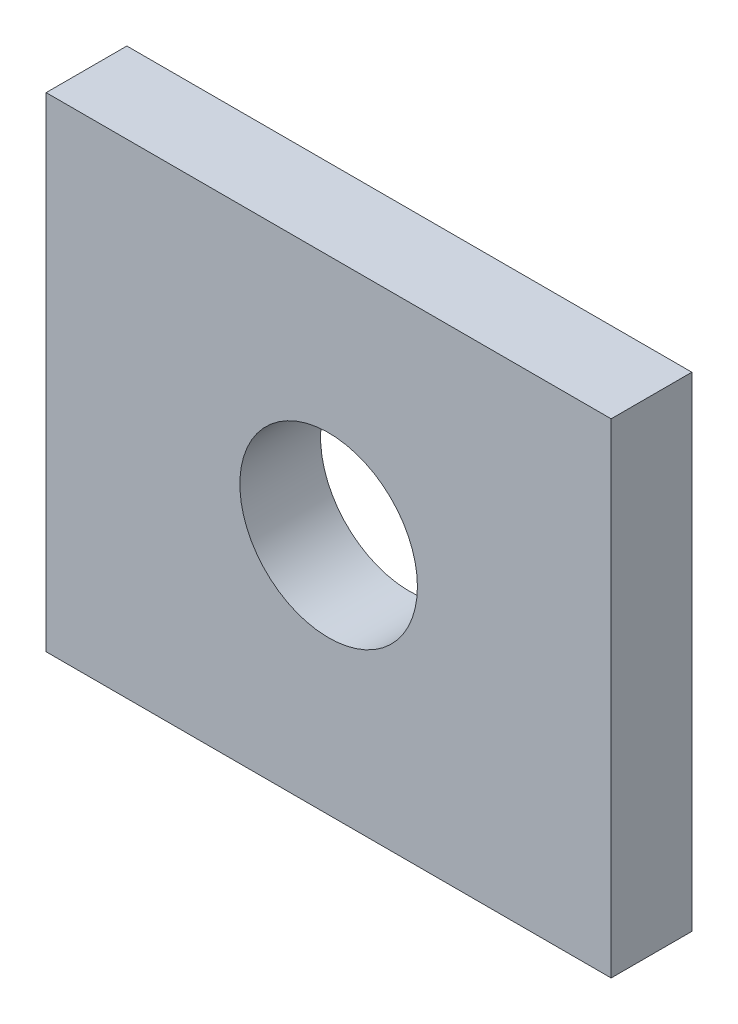
ISO-10303-21;
HEADER;
FILE_DESCRIPTION(('STEP AP214'),'2;1');
FILE_NAME('part.step','',(''),(''),'','','');
FILE_SCHEMA(('AUTOMOTIVE_DESIGN { 1 0 10303 214 1 1 1 1 }'));
ENDSEC;
DATA;
#1=APPLICATION_CONTEXT('core data for automotive mechanical design processes');
#2=APPLICATION_PROTOCOL_DEFINITION('international standard','automotive_design',2000,#1);
#3=PRODUCT_CONTEXT('',#1,'mechanical');
#4=PRODUCT('Part','Part','',(#3));
#5=PRODUCT_RELATED_PRODUCT_CATEGORY('part','',(#4));
#6=PRODUCT_DEFINITION_FORMATION('','',#4);
#7=PRODUCT_DEFINITION_CONTEXT('part definition',#1,'design');
#8=PRODUCT_DEFINITION('design','',#6,#7);
#9=PRODUCT_DEFINITION_SHAPE('','',#8);
#10=(LENGTH_UNIT() NAMED_UNIT(*) SI_UNIT(.MILLI.,.METRE.));
#11=(NAMED_UNIT(*) PLANE_ANGLE_UNIT() SI_UNIT($,.RADIAN.));
#12=(NAMED_UNIT(*) SI_UNIT($,.STERADIAN.) SOLID_ANGLE_UNIT());
#13=UNCERTAINTY_MEASURE_WITH_UNIT(LENGTH_MEASURE(1.E-05),#10,'distance_accuracy_value','');
#14=(GEOMETRIC_REPRESENTATION_CONTEXT(3) GLOBAL_UNCERTAINTY_ASSIGNED_CONTEXT((#13)) GLOBAL_UNIT_ASSIGNED_CONTEXT((#10,
#11,#12)) REPRESENTATION_CONTEXT('',''));
#15=CARTESIAN_POINT('',(0.,0.,0.));
#16=DIRECTION('',(0.,0.,1.));
#17=DIRECTION('',(1.,0.,0.));
#18=AXIS2_PLACEMENT_3D('',#15,#16,#17);
#19=CARTESIAN_POINT('',(-3.5,3.,1.));
#20=DIRECTION('',(1.,0.,0.));
#21=DIRECTION('',(0.,0.,-1.));
#22=AXIS2_PLACEMENT_3D('',#19,#20,#21);
#23=PLANE('',#22);
#24=DIRECTION('',(0.,-1.,0.));
#25=VECTOR('',#24,1.);
#26=CARTESIAN_POINT('',(-3.5,3.,0.));
#27=LINE('',#26,#25);
#28=CARTESIAN_POINT('',(-3.5,3.,0.));
#29=VERTEX_POINT('',#28);
#30=CARTESIAN_POINT('',(-3.5,-3.,0.));
#31=VERTEX_POINT('',#30);
#32=EDGE_CURVE('E106',#29,#31,#27,.T.);
#33=ORIENTED_EDGE('',*,*,#32,.T.);
#34=DIRECTION('',(0.,0.,-1.));
#35=VECTOR('',#34,1.);
#36=CARTESIAN_POINT('',(-3.5,-3.,1.));
#37=LINE('',#36,#35);
#38=CARTESIAN_POINT('',(-3.5,-3.,1.));
#39=VERTEX_POINT('',#38);
#40=EDGE_CURVE('E11',#39,#31,#37,.T.);
#41=ORIENTED_EDGE('',*,*,#40,.F.);
#42=DIRECTION('',(0.,-1.,0.));
#43=VECTOR('',#42,1.);
#44=CARTESIAN_POINT('',(-3.5,3.,1.));
#45=LINE('',#44,#43);
#46=CARTESIAN_POINT('',(-3.5,3.,1.));
#47=VERTEX_POINT('',#46);
#48=EDGE_CURVE('E91',#47,#39,#45,.T.);
#49=ORIENTED_EDGE('',*,*,#48,.F.);
#50=DIRECTION('',(0.,0.,-1.));
#51=VECTOR('',#50,1.);
#52=CARTESIAN_POINT('',(-3.5,3.,1.));
#53=LINE('',#52,#51);
#54=EDGE_CURVE('E105',#47,#29,#53,.T.);
#55=ORIENTED_EDGE('',*,*,#54,.T.);
#56=EDGE_LOOP('',(#33,#41,#49,#55));
#57=FACE_BOUND('',#56,.T.);
#58=ADVANCED_FACE('F41',(#57),#23,.F.);
#59=CARTESIAN_POINT('',(-3.5,-3.,1.));
#60=DIRECTION('',(0.,1.,0.));
#61=DIRECTION('',(0.,0.,1.));
#62=AXIS2_PLACEMENT_3D('',#59,#60,#61);
#63=PLANE('',#62);
#64=DIRECTION('',(1.,0.,0.));
#65=VECTOR('',#64,1.);
#66=CARTESIAN_POINT('',(-3.5,-3.,0.));
#67=LINE('',#66,#65);
#68=CARTESIAN_POINT('',(3.5,-3.,0.));
#69=VERTEX_POINT('',#68);
#70=EDGE_CURVE('E100',#31,#69,#67,.T.);
#71=ORIENTED_EDGE('',*,*,#70,.T.);
#72=DIRECTION('',(0.,0.,-1.));
#73=VECTOR('',#72,1.);
#74=CARTESIAN_POINT('',(3.5,-3.,1.));
#75=LINE('',#74,#73);
#76=CARTESIAN_POINT('',(3.5,-3.,1.));
#77=VERTEX_POINT('',#76);
#78=EDGE_CURVE('E49',#77,#69,#75,.T.);
#79=ORIENTED_EDGE('',*,*,#78,.F.);
#80=DIRECTION('',(1.,0.,0.));
#81=VECTOR('',#80,1.);
#82=CARTESIAN_POINT('',(-3.5,-3.,1.));
#83=LINE('',#82,#81);
#84=EDGE_CURVE('E86',#39,#77,#83,.T.);
#85=ORIENTED_EDGE('',*,*,#84,.F.);
#86=ORIENTED_EDGE('',*,*,#40,.T.);
#87=EDGE_LOOP('',(#71,#79,#85,#86));
#88=FACE_BOUND('',#87,.T.);
#89=ADVANCED_FACE('F96',(#88),#63,.F.);
#90=CARTESIAN_POINT('',(3.5,-3.,1.));
#91=DIRECTION('',(-1.,0.,0.));
#92=DIRECTION('',(0.,0.,1.));
#93=AXIS2_PLACEMENT_3D('',#90,#91,#92);
#94=PLANE('',#93);
#95=DIRECTION('',(0.,1.,0.));
#96=VECTOR('',#95,1.);
#97=CARTESIAN_POINT('',(3.5,-3.,0.));
#98=LINE('',#97,#96);
#99=CARTESIAN_POINT('',(3.5,3.,0.));
#100=VERTEX_POINT('',#99);
#101=EDGE_CURVE('E73',#69,#100,#98,.T.);
#102=ORIENTED_EDGE('',*,*,#101,.T.);
#103=DIRECTION('',(0.,0.,-1.));
#104=VECTOR('',#103,1.);
#105=CARTESIAN_POINT('',(3.5,3.,1.));
#106=LINE('',#105,#104);
#107=CARTESIAN_POINT('',(3.5,3.,1.));
#108=VERTEX_POINT('',#107);
#109=EDGE_CURVE('E98',#108,#100,#106,.T.);
#110=ORIENTED_EDGE('',*,*,#109,.F.);
#111=DIRECTION('',(0.,1.,0.));
#112=VECTOR('',#111,1.);
#113=CARTESIAN_POINT('',(3.5,-3.,1.));
#114=LINE('',#113,#112);
#115=EDGE_CURVE('E93',#77,#108,#114,.T.);
#116=ORIENTED_EDGE('',*,*,#115,.F.);
#117=ORIENTED_EDGE('',*,*,#78,.T.);
#118=EDGE_LOOP('',(#102,#110,#116,#117));
#119=FACE_BOUND('',#118,.T.);
#120=ADVANCED_FACE('F99',(#119),#94,.F.);
#121=CARTESIAN_POINT('',(3.5,3.,1.));
#122=DIRECTION('',(0.,-1.,0.));
#123=DIRECTION('',(0.,0.,-1.));
#124=AXIS2_PLACEMENT_3D('',#121,#122,#123);
#125=PLANE('',#124);
#126=DIRECTION('',(-1.,0.,0.));
#127=VECTOR('',#126,1.);
#128=CARTESIAN_POINT('',(3.5,3.,0.));
#129=LINE('',#128,#127);
#130=EDGE_CURVE('E83',#100,#29,#129,.T.);
#131=ORIENTED_EDGE('',*,*,#130,.T.);
#132=ORIENTED_EDGE('',*,*,#54,.F.);
#133=DIRECTION('',(-1.,0.,0.));
#134=VECTOR('',#133,1.);
#135=CARTESIAN_POINT('',(3.5,3.,1.));
#136=LINE('',#135,#134);
#137=EDGE_CURVE('E59',#108,#47,#136,.T.);
#138=ORIENTED_EDGE('',*,*,#137,.F.);
#139=ORIENTED_EDGE('',*,*,#109,.T.);
#140=EDGE_LOOP('',(#131,#132,#138,#139));
#141=FACE_BOUND('',#140,.T.);
#142=ADVANCED_FACE('F111',(#141),#125,.F.);
#143=CARTESIAN_POINT('',(0.,0.,1.));
#144=DIRECTION('',(0.,0.,1.));
#145=DIRECTION('',(1.,0.,0.));
#146=AXIS2_PLACEMENT_3D('',#143,#144,#145);
#147=PLANE('',#146);
#148=CARTESIAN_POINT('',(0.,0.,1.));
#149=DIRECTION('',(0.,0.,1.));
#150=DIRECTION('',(1.,0.,0.));
#151=AXIS2_PLACEMENT_3D('',#148,#149,#150);
#152=CIRCLE('',#151,1.1);
#153=CARTESIAN_POINT('',(1.1,0.,1.));
#154=VERTEX_POINT('',#153);
#155=EDGE_CURVE('E108',#154,#154,#152,.F.);
#156=ORIENTED_EDGE('',*,*,#155,.T.);
#157=EDGE_LOOP('',(#156));
#158=FACE_BOUND('',#157,.T.);
#159=ORIENTED_EDGE('',*,*,#48,.T.);
#160=ORIENTED_EDGE('',*,*,#84,.T.);
#161=ORIENTED_EDGE('',*,*,#115,.T.);
#162=ORIENTED_EDGE('',*,*,#137,.T.);
#163=EDGE_LOOP('',(#159,#160,#161,#162));
#164=FACE_BOUND('',#163,.T.);
#165=ADVANCED_FACE('F90',(#158,#164),#147,.T.);
#166=CARTESIAN_POINT('',(0.,0.,0.));
#167=DIRECTION('',(0.,0.,1.));
#168=DIRECTION('',(1.,0.,0.));
#169=AXIS2_PLACEMENT_3D('',#166,#167,#168);
#170=PLANE('',#169);
#171=CARTESIAN_POINT('',(0.,0.,0.));
#172=DIRECTION('',(0.,0.,1.));
#173=DIRECTION('',(1.,0.,0.));
#174=AXIS2_PLACEMENT_3D('',#171,#172,#173);
#175=CIRCLE('',#174,1.1);
#176=CARTESIAN_POINT('',(1.1,0.,0.));
#177=VERTEX_POINT('',#176);
#178=EDGE_CURVE('E42',#177,#177,#175,.F.);
#179=ORIENTED_EDGE('',*,*,#178,.F.);
#180=EDGE_LOOP('',(#179));
#181=FACE_BOUND('',#180,.T.);
#182=ORIENTED_EDGE('',*,*,#32,.F.);
#183=ORIENTED_EDGE('',*,*,#130,.F.);
#184=ORIENTED_EDGE('',*,*,#101,.F.);
#185=ORIENTED_EDGE('',*,*,#70,.F.);
#186=EDGE_LOOP('',(#182,#183,#184,#185));
#187=FACE_BOUND('',#186,.T.);
#188=ADVANCED_FACE('F116',(#181,#187),#170,.F.);
#189=CARTESIAN_POINT('',(0.,0.,1.1));
#190=DIRECTION('',(0.,0.,-1.));
#191=DIRECTION('',(-1.,0.,0.));
#192=AXIS2_PLACEMENT_3D('',#189,#190,#191);
#193=CYLINDRICAL_SURFACE('',#192,1.1);
#194=ORIENTED_EDGE('',*,*,#155,.F.);
#195=EDGE_LOOP('',(#194));
#196=FACE_BOUND('',#195,.T.);
#197=ORIENTED_EDGE('',*,*,#178,.T.);
#198=EDGE_LOOP('',(#197));
#199=FACE_BOUND('',#198,.T.);
#200=ADVANCED_FACE('F127',(#196,#199),#193,.F.);
#201=CLOSED_SHELL('',(#58,#89,#120,#142,#165,#188,#200));
#202=MANIFOLD_SOLID_BREP('B2',#201);
#203=ADVANCED_BREP_SHAPE_REPRESENTATION('',(#18,#202),#14);
#204=SHAPE_DEFINITION_REPRESENTATION(#9,#203);
ENDSEC;
END-ISO-10303-21;
